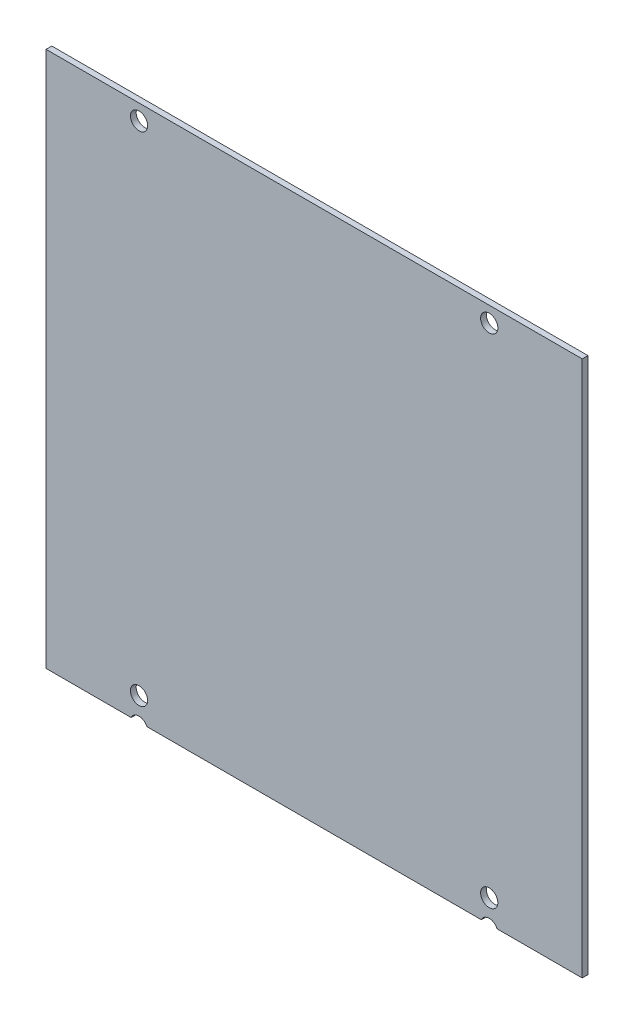
ISO-10303-21;
HEADER;
FILE_DESCRIPTION(('STEP AP214'),'2;1');
FILE_NAME('part.step','',(''),(''),'','','');
FILE_SCHEMA(('AUTOMOTIVE_DESIGN { 1 0 10303 214 1 1 1 1 }'));
ENDSEC;
DATA;
#1=APPLICATION_CONTEXT('core data for automotive mechanical design processes');
#2=APPLICATION_PROTOCOL_DEFINITION('international standard','automotive_design',2000,#1);
#3=PRODUCT_CONTEXT('',#1,'mechanical');
#4=PRODUCT('Part','Part','',(#3));
#5=PRODUCT_RELATED_PRODUCT_CATEGORY('part','',(#4));
#6=PRODUCT_DEFINITION_FORMATION('','',#4);
#7=PRODUCT_DEFINITION_CONTEXT('part definition',#1,'design');
#8=PRODUCT_DEFINITION('design','',#6,#7);
#9=PRODUCT_DEFINITION_SHAPE('','',#8);
#10=(LENGTH_UNIT() NAMED_UNIT(*) SI_UNIT(.MILLI.,.METRE.));
#11=(NAMED_UNIT(*) PLANE_ANGLE_UNIT() SI_UNIT($,.RADIAN.));
#12=(NAMED_UNIT(*) SI_UNIT($,.STERADIAN.) SOLID_ANGLE_UNIT());
#13=UNCERTAINTY_MEASURE_WITH_UNIT(LENGTH_MEASURE(1.E-05),#10,'distance_accuracy_value','');
#14=(GEOMETRIC_REPRESENTATION_CONTEXT(3) GLOBAL_UNCERTAINTY_ASSIGNED_CONTEXT((#13)) GLOBAL_UNIT_ASSIGNED_CONTEXT((#10,
#11,#12)) REPRESENTATION_CONTEXT('',''));
#15=CARTESIAN_POINT('',(0.,0.,0.));
#16=DIRECTION('',(0.,0.,1.));
#17=DIRECTION('',(1.,0.,0.));
#18=AXIS2_PLACEMENT_3D('',#15,#16,#17);
#19=CARTESIAN_POINT('',(46.7,-46.7,1.));
#20=DIRECTION('',(0.,1.,0.));
#21=DIRECTION('',(-1.,0.,0.));
#22=AXIS2_PLACEMENT_3D('',#19,#20,#21);
#23=PLANE('',#22);
#24=DIRECTION('',(1.,0.,0.));
#25=VECTOR('',#24,1.);
#26=CARTESIAN_POINT('',(46.7,-46.7,0.));
#27=LINE('',#26,#25);
#28=CARTESIAN_POINT('',(-46.7,-46.7,0.));
#29=VERTEX_POINT('',#28);
#30=CARTESIAN_POINT('',(-31.8747727084866,-46.7,0.));
#31=VERTEX_POINT('',#30);
#32=EDGE_CURVE('E117',#29,#31,#27,.T.);
#33=ORIENTED_EDGE('',*,*,#32,.T.);
#34=DIRECTION('',(0.,0.,1.));
#35=VECTOR('',#34,1.);
#36=CARTESIAN_POINT('',(-31.8747727084866,-46.7,1.));
#37=LINE('',#36,#35);
#38=CARTESIAN_POINT('',(-31.8747727084866,-46.7,1.));
#39=VERTEX_POINT('',#38);
#40=EDGE_CURVE('E52',#31,#39,#37,.T.);
#41=ORIENTED_EDGE('',*,*,#40,.T.);
#42=DIRECTION('',(1.,0.,0.));
#43=VECTOR('',#42,1.);
#44=CARTESIAN_POINT('',(46.7,-46.7,1.));
#45=LINE('',#44,#43);
#46=CARTESIAN_POINT('',(-46.7,-46.7,1.));
#47=VERTEX_POINT('',#46);
#48=EDGE_CURVE('E161',#47,#39,#45,.T.);
#49=ORIENTED_EDGE('',*,*,#48,.F.);
#50=DIRECTION('',(0.,0.,-1.));
#51=VECTOR('',#50,1.);
#52=CARTESIAN_POINT('',(-46.7,-46.7,1.));
#53=LINE('',#52,#51);
#54=EDGE_CURVE('E11',#47,#29,#53,.T.);
#55=ORIENTED_EDGE('',*,*,#54,.T.);
#56=EDGE_LOOP('',(#33,#41,#49,#55));
#57=FACE_BOUND('',#56,.T.);
#58=ADVANCED_FACE('F37',(#57),#23,.F.);
#59=CARTESIAN_POINT('',(-29.1252272915134,-46.7,1.));
#60=VERTEX_POINT('',#59);
#61=CARTESIAN_POINT('',(29.1252272915135,-46.7,1.));
#62=VERTEX_POINT('',#61);
#63=EDGE_CURVE('E111',#60,#62,#45,.T.);
#64=ORIENTED_EDGE('',*,*,#63,.F.);
#65=DIRECTION('',(0.,0.,1.));
#66=VECTOR('',#65,1.);
#67=CARTESIAN_POINT('',(-29.1252272915134,-46.7,1.));
#68=LINE('',#67,#66);
#69=CARTESIAN_POINT('',(-29.1252272915134,-46.7,0.));
#70=VERTEX_POINT('',#69);
#71=EDGE_CURVE('E103',#60,#70,#68,.F.);
#72=ORIENTED_EDGE('',*,*,#71,.T.);
#73=CARTESIAN_POINT('',(29.1252272915135,-46.7,0.));
#74=VERTEX_POINT('',#73);
#75=EDGE_CURVE('E60',#70,#74,#27,.T.);
#76=ORIENTED_EDGE('',*,*,#75,.T.);
#77=DIRECTION('',(0.,0.,1.));
#78=VECTOR('',#77,1.);
#79=CARTESIAN_POINT('',(29.1252272915135,-46.7,1.));
#80=LINE('',#79,#78);
#81=EDGE_CURVE('E175',#74,#62,#80,.T.);
#82=ORIENTED_EDGE('',*,*,#81,.T.);
#83=EDGE_LOOP('',(#64,#72,#76,#82));
#84=FACE_BOUND('',#83,.T.);
#85=ADVANCED_FACE('F110',(#84),#23,.F.);
#86=CARTESIAN_POINT('',(-46.7,-46.7,1.));
#87=DIRECTION('',(1.,0.,0.));
#88=DIRECTION('',(0.,0.,-1.));
#89=AXIS2_PLACEMENT_3D('',#86,#87,#88);
#90=PLANE('',#89);
#91=DIRECTION('',(0.,-1.,0.));
#92=VECTOR('',#91,1.);
#93=CARTESIAN_POINT('',(-46.7,-46.7,0.));
#94=LINE('',#93,#92);
#95=CARTESIAN_POINT('',(-46.7,46.7,0.));
#96=VERTEX_POINT('',#95);
#97=EDGE_CURVE('E121',#96,#29,#94,.T.);
#98=ORIENTED_EDGE('',*,*,#97,.T.);
#99=ORIENTED_EDGE('',*,*,#54,.F.);
#100=DIRECTION('',(0.,-1.,0.));
#101=VECTOR('',#100,1.);
#102=CARTESIAN_POINT('',(-46.7,-46.7,1.));
#103=LINE('',#102,#101);
#104=CARTESIAN_POINT('',(-46.7,46.7,1.));
#105=VERTEX_POINT('',#104);
#106=EDGE_CURVE('E128',#105,#47,#103,.T.);
#107=ORIENTED_EDGE('',*,*,#106,.F.);
#108=DIRECTION('',(0.,0.,-1.));
#109=VECTOR('',#108,1.);
#110=CARTESIAN_POINT('',(-46.7,46.7,1.));
#111=LINE('',#110,#109);
#112=EDGE_CURVE('E129',#105,#96,#111,.T.);
#113=ORIENTED_EDGE('',*,*,#112,.T.);
#114=EDGE_LOOP('',(#98,#99,#107,#113));
#115=FACE_BOUND('',#114,.T.);
#116=ADVANCED_FACE('F39',(#115),#90,.F.);
#117=CARTESIAN_POINT('',(31.8747727084865,-46.7,1.));
#118=VERTEX_POINT('',#117);
#119=CARTESIAN_POINT('',(46.7,-46.7,1.));
#120=VERTEX_POINT('',#119);
#121=EDGE_CURVE('E158',#118,#120,#45,.T.);
#122=ORIENTED_EDGE('',*,*,#121,.F.);
#123=DIRECTION('',(0.,0.,1.));
#124=VECTOR('',#123,1.);
#125=CARTESIAN_POINT('',(31.8747727084865,-46.7,1.));
#126=LINE('',#125,#124);
#127=CARTESIAN_POINT('',(31.8747727084865,-46.7,0.));
#128=VERTEX_POINT('',#127);
#129=EDGE_CURVE('E173',#118,#128,#126,.F.);
#130=ORIENTED_EDGE('',*,*,#129,.T.);
#131=CARTESIAN_POINT('',(46.7,-46.7,0.));
#132=VERTEX_POINT('',#131);
#133=EDGE_CURVE('E118',#128,#132,#27,.T.);
#134=ORIENTED_EDGE('',*,*,#133,.T.);
#135=DIRECTION('',(0.,0.,-1.));
#136=VECTOR('',#135,1.);
#137=CARTESIAN_POINT('',(46.7,-46.7,1.));
#138=LINE('',#137,#136);
#139=EDGE_CURVE('E45',#120,#132,#138,.T.);
#140=ORIENTED_EDGE('',*,*,#139,.F.);
#141=EDGE_LOOP('',(#122,#130,#134,#140));
#142=FACE_BOUND('',#141,.T.);
#143=ADVANCED_FACE('F172',(#142),#23,.F.);
#144=CARTESIAN_POINT('',(46.7,-46.7,1.));
#145=DIRECTION('',(-1.,0.,0.));
#146=DIRECTION('',(0.,0.,1.));
#147=AXIS2_PLACEMENT_3D('',#144,#145,#146);
#148=PLANE('',#147);
#149=DIRECTION('',(0.,1.,0.));
#150=VECTOR('',#149,1.);
#151=CARTESIAN_POINT('',(46.7,-46.7,0.));
#152=LINE('',#151,#150);
#153=CARTESIAN_POINT('',(46.7,46.7,0.));
#154=VERTEX_POINT('',#153);
#155=EDGE_CURVE('E120',#132,#154,#152,.T.);
#156=ORIENTED_EDGE('',*,*,#155,.T.);
#157=DIRECTION('',(0.,0.,-1.));
#158=VECTOR('',#157,1.);
#159=CARTESIAN_POINT('',(46.7,46.7,1.));
#160=LINE('',#159,#158);
#161=CARTESIAN_POINT('',(46.7,46.7,1.));
#162=VERTEX_POINT('',#161);
#163=EDGE_CURVE('E132',#162,#154,#160,.T.);
#164=ORIENTED_EDGE('',*,*,#163,.F.);
#165=DIRECTION('',(0.,1.,0.));
#166=VECTOR('',#165,1.);
#167=CARTESIAN_POINT('',(46.7,-46.7,1.));
#168=LINE('',#167,#166);
#169=EDGE_CURVE('E142',#120,#162,#168,.T.);
#170=ORIENTED_EDGE('',*,*,#169,.F.);
#171=ORIENTED_EDGE('',*,*,#139,.T.);
#172=EDGE_LOOP('',(#156,#164,#170,#171));
#173=FACE_BOUND('',#172,.T.);
#174=ADVANCED_FACE('F140',(#173),#148,.F.);
#175=CARTESIAN_POINT('',(46.7,46.7,1.));
#176=DIRECTION('',(0.,-1.,0.));
#177=DIRECTION('',(1.,0.,0.));
#178=AXIS2_PLACEMENT_3D('',#175,#176,#177);
#179=PLANE('',#178);
#180=DIRECTION('',(-1.,0.,0.));
#181=VECTOR('',#180,1.);
#182=CARTESIAN_POINT('',(46.7,46.7,0.));
#183=LINE('',#182,#181);
#184=EDGE_CURVE('E126',#154,#96,#183,.T.);
#185=ORIENTED_EDGE('',*,*,#184,.T.);
#186=ORIENTED_EDGE('',*,*,#112,.F.);
#187=DIRECTION('',(-1.,0.,0.));
#188=VECTOR('',#187,1.);
#189=CARTESIAN_POINT('',(46.7,46.7,1.));
#190=LINE('',#189,#188);
#191=EDGE_CURVE('E133',#162,#105,#190,.T.);
#192=ORIENTED_EDGE('',*,*,#191,.F.);
#193=ORIENTED_EDGE('',*,*,#163,.T.);
#194=EDGE_LOOP('',(#185,#186,#192,#193));
#195=FACE_BOUND('',#194,.T.);
#196=ADVANCED_FACE('F150',(#195),#179,.F.);
#197=CARTESIAN_POINT('',(0.,0.,1.));
#198=DIRECTION('',(0.,0.,1.));
#199=DIRECTION('',(1.,0.,0.));
#200=AXIS2_PLACEMENT_3D('',#197,#198,#199);
#201=PLANE('',#200);
#202=CARTESIAN_POINT('',(-30.5,-47.3000000000004,1.));
#203=DIRECTION('',(0.,0.,1.));
#204=DIRECTION('',(1.,0.,0.));
#205=AXIS2_PLACEMENT_3D('',#202,#203,#204);
#206=CIRCLE('',#205,1.5);
#207=EDGE_CURVE('E107',#60,#39,#206,.T.);
#208=ORIENTED_EDGE('',*,*,#207,.F.);
#209=ORIENTED_EDGE('',*,*,#63,.T.);
#210=CARTESIAN_POINT('',(30.5,-47.3000000000006,1.));
#211=DIRECTION('',(0.,0.,1.));
#212=DIRECTION('',(1.,0.,0.));
#213=AXIS2_PLACEMENT_3D('',#210,#211,#212);
#214=CIRCLE('',#213,1.5);
#215=EDGE_CURVE('E170',#118,#62,#214,.T.);
#216=ORIENTED_EDGE('',*,*,#215,.F.);
#217=ORIENTED_EDGE('',*,*,#121,.T.);
#218=ORIENTED_EDGE('',*,*,#169,.T.);
#219=ORIENTED_EDGE('',*,*,#191,.T.);
#220=ORIENTED_EDGE('',*,*,#106,.T.);
#221=ORIENTED_EDGE('',*,*,#48,.T.);
#222=EDGE_LOOP('',(#208,#209,#216,#217,#218,#219,#220,#221));
#223=FACE_BOUND('',#222,.T.);
#224=CARTESIAN_POINT('',(30.5,-42.7,1.));
#225=DIRECTION('',(0.,0.,1.));
#226=DIRECTION('',(1.,0.,0.));
#227=AXIS2_PLACEMENT_3D('',#224,#225,#226);
#228=CIRCLE('',#227,1.5);
#229=CARTESIAN_POINT('',(32.,-42.7,1.));
#230=VERTEX_POINT('',#229);
#231=EDGE_CURVE('E177',#230,#230,#228,.T.);
#232=ORIENTED_EDGE('',*,*,#231,.F.);
#233=EDGE_LOOP('',(#232));
#234=FACE_BOUND('',#233,.T.);
#235=CARTESIAN_POINT('',(-30.5,-42.7,1.));
#236=DIRECTION('',(0.,0.,1.));
#237=DIRECTION('',(1.,0.,0.));
#238=AXIS2_PLACEMENT_3D('',#235,#236,#237);
#239=CIRCLE('',#238,1.5);
#240=CARTESIAN_POINT('',(-29.,-42.7,1.));
#241=VERTEX_POINT('',#240);
#242=EDGE_CURVE('E187',#241,#241,#239,.T.);
#243=ORIENTED_EDGE('',*,*,#242,.F.);
#244=EDGE_LOOP('',(#243));
#245=FACE_BOUND('',#244,.T.);
#246=CARTESIAN_POINT('',(-30.5,44.,1.));
#247=DIRECTION('',(0.,0.,1.));
#248=DIRECTION('',(1.,0.,0.));
#249=AXIS2_PLACEMENT_3D('',#246,#247,#248);
#250=CIRCLE('',#249,1.5);
#251=CARTESIAN_POINT('',(-29.,44.,1.));
#252=VERTEX_POINT('',#251);
#253=EDGE_CURVE('E193',#252,#252,#250,.T.);
#254=ORIENTED_EDGE('',*,*,#253,.F.);
#255=EDGE_LOOP('',(#254));
#256=FACE_BOUND('',#255,.T.);
#257=CARTESIAN_POINT('',(30.5,44.,1.));
#258=DIRECTION('',(0.,0.,1.));
#259=DIRECTION('',(1.,0.,0.));
#260=AXIS2_PLACEMENT_3D('',#257,#258,#259);
#261=CIRCLE('',#260,1.5);
#262=CARTESIAN_POINT('',(32.,44.,1.));
#263=VERTEX_POINT('',#262);
#264=EDGE_CURVE('E198',#263,#263,#261,.T.);
#265=ORIENTED_EDGE('',*,*,#264,.F.);
#266=EDGE_LOOP('',(#265));
#267=FACE_BOUND('',#266,.T.);
#268=ADVANCED_FACE('F166',(#223,#234,#245,#256,#267),#201,.T.);
#269=CARTESIAN_POINT('',(0.,0.,0.));
#270=DIRECTION('',(0.,0.,1.));
#271=DIRECTION('',(1.,0.,0.));
#272=AXIS2_PLACEMENT_3D('',#269,#270,#271);
#273=PLANE('',#272);
#274=CARTESIAN_POINT('',(30.5,-42.7,0.));
#275=DIRECTION('',(0.,0.,1.));
#276=DIRECTION('',(1.,0.,0.));
#277=AXIS2_PLACEMENT_3D('',#274,#275,#276);
#278=CIRCLE('',#277,1.5);
#279=CARTESIAN_POINT('',(32.,-42.7,0.));
#280=VERTEX_POINT('',#279);
#281=EDGE_CURVE('E184',#280,#280,#278,.T.);
#282=ORIENTED_EDGE('',*,*,#281,.T.);
#283=EDGE_LOOP('',(#282));
#284=FACE_BOUND('',#283,.T.);
#285=CARTESIAN_POINT('',(-30.5,-42.7,0.));
#286=DIRECTION('',(0.,0.,1.));
#287=DIRECTION('',(1.,0.,0.));
#288=AXIS2_PLACEMENT_3D('',#285,#286,#287);
#289=CIRCLE('',#288,1.5);
#290=CARTESIAN_POINT('',(-29.,-42.7,0.));
#291=VERTEX_POINT('',#290);
#292=EDGE_CURVE('E190',#291,#291,#289,.T.);
#293=ORIENTED_EDGE('',*,*,#292,.T.);
#294=EDGE_LOOP('',(#293));
#295=FACE_BOUND('',#294,.T.);
#296=CARTESIAN_POINT('',(-30.5,44.,0.));
#297=DIRECTION('',(0.,0.,1.));
#298=DIRECTION('',(1.,0.,0.));
#299=AXIS2_PLACEMENT_3D('',#296,#297,#298);
#300=CIRCLE('',#299,1.5);
#301=CARTESIAN_POINT('',(-29.,44.,0.));
#302=VERTEX_POINT('',#301);
#303=EDGE_CURVE('E196',#302,#302,#300,.T.);
#304=ORIENTED_EDGE('',*,*,#303,.T.);
#305=EDGE_LOOP('',(#304));
#306=FACE_BOUND('',#305,.T.);
#307=CARTESIAN_POINT('',(30.5,44.,0.));
#308=DIRECTION('',(0.,0.,1.));
#309=DIRECTION('',(1.,0.,0.));
#310=AXIS2_PLACEMENT_3D('',#307,#308,#309);
#311=CIRCLE('',#310,1.5);
#312=CARTESIAN_POINT('',(32.,44.,0.));
#313=VERTEX_POINT('',#312);
#314=EDGE_CURVE('E163',#313,#313,#311,.T.);
#315=ORIENTED_EDGE('',*,*,#314,.T.);
#316=EDGE_LOOP('',(#315));
#317=FACE_BOUND('',#316,.T.);
#318=ORIENTED_EDGE('',*,*,#75,.F.);
#319=CARTESIAN_POINT('',(-30.5,-47.3000000000004,0.));
#320=DIRECTION('',(0.,0.,1.));
#321=DIRECTION('',(1.,0.,0.));
#322=AXIS2_PLACEMENT_3D('',#319,#320,#321);
#323=CIRCLE('',#322,1.5);
#324=EDGE_CURVE('E101',#70,#31,#323,.T.);
#325=ORIENTED_EDGE('',*,*,#324,.T.);
#326=ORIENTED_EDGE('',*,*,#32,.F.);
#327=ORIENTED_EDGE('',*,*,#97,.F.);
#328=ORIENTED_EDGE('',*,*,#184,.F.);
#329=ORIENTED_EDGE('',*,*,#155,.F.);
#330=ORIENTED_EDGE('',*,*,#133,.F.);
#331=CARTESIAN_POINT('',(30.5,-47.3000000000006,0.));
#332=DIRECTION('',(0.,0.,1.));
#333=DIRECTION('',(1.,0.,0.));
#334=AXIS2_PLACEMENT_3D('',#331,#332,#333);
#335=CIRCLE('',#334,1.5);
#336=EDGE_CURVE('E116',#128,#74,#335,.T.);
#337=ORIENTED_EDGE('',*,*,#336,.T.);
#338=EDGE_LOOP('',(#318,#325,#326,#327,#328,#329,#330,#337));
#339=FACE_BOUND('',#338,.T.);
#340=ADVANCED_FACE('F114',(#284,#295,#306,#317,#339),#273,.F.);
#341=CARTESIAN_POINT('',(30.5,44.,1.));
#342=DIRECTION('',(0.,0.,1.));
#343=DIRECTION('',(1.,0.,0.));
#344=AXIS2_PLACEMENT_3D('',#341,#342,#343);
#345=CYLINDRICAL_SURFACE('',#344,1.5);
#346=ORIENTED_EDGE('',*,*,#314,.F.);
#347=EDGE_LOOP('',(#346));
#348=FACE_BOUND('',#347,.T.);
#349=ORIENTED_EDGE('',*,*,#264,.T.);
#350=EDGE_LOOP('',(#349));
#351=FACE_BOUND('',#350,.T.);
#352=ADVANCED_FACE('F206',(#348,#351),#345,.F.);
#353=CARTESIAN_POINT('',(-30.5,44.,1.));
#354=DIRECTION('',(0.,0.,1.));
#355=DIRECTION('',(1.,0.,0.));
#356=AXIS2_PLACEMENT_3D('',#353,#354,#355);
#357=CYLINDRICAL_SURFACE('',#356,1.5);
#358=ORIENTED_EDGE('',*,*,#303,.F.);
#359=EDGE_LOOP('',(#358));
#360=FACE_BOUND('',#359,.T.);
#361=ORIENTED_EDGE('',*,*,#253,.T.);
#362=EDGE_LOOP('',(#361));
#363=FACE_BOUND('',#362,.T.);
#364=ADVANCED_FACE('F208',(#360,#363),#357,.F.);
#365=CARTESIAN_POINT('',(-30.5,-42.7,1.));
#366=DIRECTION('',(0.,0.,1.));
#367=DIRECTION('',(1.,0.,0.));
#368=AXIS2_PLACEMENT_3D('',#365,#366,#367);
#369=CYLINDRICAL_SURFACE('',#368,1.5);
#370=ORIENTED_EDGE('',*,*,#292,.F.);
#371=EDGE_LOOP('',(#370));
#372=FACE_BOUND('',#371,.T.);
#373=ORIENTED_EDGE('',*,*,#242,.T.);
#374=EDGE_LOOP('',(#373));
#375=FACE_BOUND('',#374,.T.);
#376=ADVANCED_FACE('F214',(#372,#375),#369,.F.);
#377=CARTESIAN_POINT('',(30.5,-42.7,1.));
#378=DIRECTION('',(0.,0.,1.));
#379=DIRECTION('',(1.,0.,0.));
#380=AXIS2_PLACEMENT_3D('',#377,#378,#379);
#381=CYLINDRICAL_SURFACE('',#380,1.5);
#382=ORIENTED_EDGE('',*,*,#281,.F.);
#383=EDGE_LOOP('',(#382));
#384=FACE_BOUND('',#383,.T.);
#385=ORIENTED_EDGE('',*,*,#231,.T.);
#386=EDGE_LOOP('',(#385));
#387=FACE_BOUND('',#386,.T.);
#388=ADVANCED_FACE('F280',(#384,#387),#381,.F.);
#389=CARTESIAN_POINT('',(30.5,-47.3000000000006,1.));
#390=DIRECTION('',(0.,0.,1.));
#391=DIRECTION('',(1.,0.,0.));
#392=AXIS2_PLACEMENT_3D('',#389,#390,#391);
#393=CYLINDRICAL_SURFACE('',#392,1.5);
#394=ORIENTED_EDGE('',*,*,#336,.F.);
#395=ORIENTED_EDGE('',*,*,#129,.F.);
#396=ORIENTED_EDGE('',*,*,#215,.T.);
#397=ORIENTED_EDGE('',*,*,#81,.F.);
#398=EDGE_LOOP('',(#394,#395,#396,#397));
#399=FACE_BOUND('',#398,.T.);
#400=ADVANCED_FACE('F290',(#399),#393,.F.);
#401=CARTESIAN_POINT('',(-30.5,-47.3000000000004,1.));
#402=DIRECTION('',(0.,0.,1.));
#403=DIRECTION('',(1.,0.,0.));
#404=AXIS2_PLACEMENT_3D('',#401,#402,#403);
#405=CYLINDRICAL_SURFACE('',#404,1.5);
#406=ORIENTED_EDGE('',*,*,#324,.F.);
#407=ORIENTED_EDGE('',*,*,#71,.F.);
#408=ORIENTED_EDGE('',*,*,#207,.T.);
#409=ORIENTED_EDGE('',*,*,#40,.F.);
#410=EDGE_LOOP('',(#406,#407,#408,#409));
#411=FACE_BOUND('',#410,.T.);
#412=ADVANCED_FACE('F102',(#411),#405,.F.);
#413=CLOSED_SHELL('',(#58,#85,#116,#143,#174,#196,#268,#340,#352,#364,#376,#388,#400,#412));
#414=MANIFOLD_SOLID_BREP('B2',#413);
#415=ADVANCED_BREP_SHAPE_REPRESENTATION('',(#18,#414),#14);
#416=SHAPE_DEFINITION_REPRESENTATION(#9,#415);
ENDSEC;
END-ISO-10303-21;
